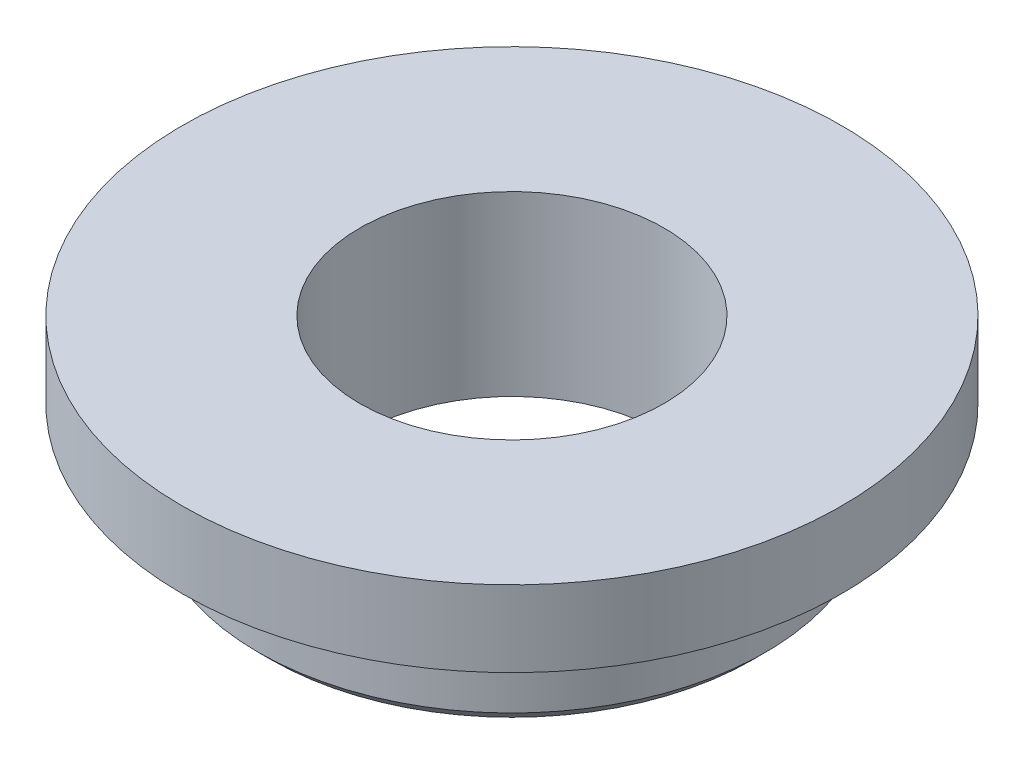
ISO-10303-21;
HEADER;
FILE_DESCRIPTION(('STEP AP214'),'2;1');
FILE_NAME('part.step','',(''),(''),'','','');
FILE_SCHEMA(('AUTOMOTIVE_DESIGN { 1 0 10303 214 1 1 1 1 }'));
ENDSEC;
DATA;
#1=APPLICATION_CONTEXT('core data for automotive mechanical design processes');
#2=APPLICATION_PROTOCOL_DEFINITION('international standard','automotive_design',2000,#1);
#3=PRODUCT_CONTEXT('',#1,'mechanical');
#4=PRODUCT('Part','Part','',(#3));
#5=PRODUCT_RELATED_PRODUCT_CATEGORY('part','',(#4));
#6=PRODUCT_DEFINITION_FORMATION('','',#4);
#7=PRODUCT_DEFINITION_CONTEXT('part definition',#1,'design');
#8=PRODUCT_DEFINITION('design','',#6,#7);
#9=PRODUCT_DEFINITION_SHAPE('','',#8);
#10=(LENGTH_UNIT() NAMED_UNIT(*) SI_UNIT(.MILLI.,.METRE.));
#11=(NAMED_UNIT(*) PLANE_ANGLE_UNIT() SI_UNIT($,.RADIAN.));
#12=(NAMED_UNIT(*) SI_UNIT($,.STERADIAN.) SOLID_ANGLE_UNIT());
#13=UNCERTAINTY_MEASURE_WITH_UNIT(LENGTH_MEASURE(1.E-05),#10,'distance_accuracy_value','');
#14=(GEOMETRIC_REPRESENTATION_CONTEXT(3) GLOBAL_UNCERTAINTY_ASSIGNED_CONTEXT((#13)) GLOBAL_UNIT_ASSIGNED_CONTEXT((#10,
#11,#12)) REPRESENTATION_CONTEXT('',''));
#15=CARTESIAN_POINT('',(0.,0.,0.));
#16=DIRECTION('',(0.,0.,1.));
#17=DIRECTION('',(1.,0.,0.));
#18=AXIS2_PLACEMENT_3D('',#15,#16,#17);
#19=CARTESIAN_POINT('',(0.,3.,0.));
#20=DIRECTION('',(0.,-1.,0.));
#21=DIRECTION('',(0.,0.,-1.));
#22=AXIS2_PLACEMENT_3D('',#19,#20,#21);
#23=CYLINDRICAL_SURFACE('',#22,13.);
#24=CARTESIAN_POINT('',(0.,3.,0.));
#25=DIRECTION('',(0.,1.,0.));
#26=DIRECTION('',(0.,0.,1.));
#27=AXIS2_PLACEMENT_3D('',#24,#25,#26);
#28=CIRCLE('',#27,13.);
#29=CARTESIAN_POINT('',(0.,3.,13.));
#30=VERTEX_POINT('',#29);
#31=EDGE_CURVE('E63',#30,#30,#28,.T.);
#32=ORIENTED_EDGE('',*,*,#31,.F.);
#33=EDGE_LOOP('',(#32));
#34=FACE_BOUND('',#33,.T.);
#35=CARTESIAN_POINT('',(0.,0.,0.));
#36=DIRECTION('',(0.,1.,0.));
#37=DIRECTION('',(0.,0.,1.));
#38=AXIS2_PLACEMENT_3D('',#35,#36,#37);
#39=CIRCLE('',#38,13.);
#40=CARTESIAN_POINT('',(0.,0.,13.));
#41=VERTEX_POINT('',#40);
#42=EDGE_CURVE('E64',#41,#41,#39,.T.);
#43=ORIENTED_EDGE('',*,*,#42,.T.);
#44=EDGE_LOOP('',(#43));
#45=FACE_BOUND('',#44,.T.);
#46=ADVANCED_FACE('F42',(#34,#45),#23,.T.);
#47=CARTESIAN_POINT('',(0.,3.,0.));
#48=DIRECTION('',(0.,1.,0.));
#49=DIRECTION('',(0.,0.,1.));
#50=AXIS2_PLACEMENT_3D('',#47,#48,#49);
#51=PLANE('',#50);
#52=CARTESIAN_POINT('',(0.,3.,0.));
#53=DIRECTION('',(0.,1.,0.));
#54=DIRECTION('',(0.,0.,1.));
#55=AXIS2_PLACEMENT_3D('',#52,#53,#54);
#56=CIRCLE('',#55,6.);
#57=CARTESIAN_POINT('',(0.,3.,6.));
#58=VERTEX_POINT('',#57);
#59=EDGE_CURVE('E70',#58,#58,#56,.T.);
#60=ORIENTED_EDGE('',*,*,#59,.F.);
#61=EDGE_LOOP('',(#60));
#62=FACE_BOUND('',#61,.T.);
#63=ORIENTED_EDGE('',*,*,#31,.T.);
#64=EDGE_LOOP('',(#63));
#65=FACE_BOUND('',#64,.T.);
#66=ADVANCED_FACE('F84',(#62,#65),#51,.T.);
#67=CARTESIAN_POINT('',(0.,0.,0.));
#68=DIRECTION('',(0.,1.,0.));
#69=DIRECTION('',(0.,0.,1.));
#70=AXIS2_PLACEMENT_3D('',#67,#68,#69);
#71=PLANE('',#70);
#72=CARTESIAN_POINT('',(0.,0.,0.));
#73=DIRECTION('',(0.,1.,0.));
#74=DIRECTION('',(0.,0.,1.));
#75=AXIS2_PLACEMENT_3D('',#72,#73,#74);
#76=CIRCLE('',#75,10.5);
#77=CARTESIAN_POINT('',(0.,0.,10.5));
#78=VERTEX_POINT('',#77);
#79=EDGE_CURVE('E50',#78,#78,#76,.T.);
#80=ORIENTED_EDGE('',*,*,#79,.T.);
#81=EDGE_LOOP('',(#80));
#82=FACE_BOUND('',#81,.T.);
#83=ORIENTED_EDGE('',*,*,#42,.F.);
#84=EDGE_LOOP('',(#83));
#85=FACE_BOUND('',#84,.T.);
#86=ADVANCED_FACE('F87',(#82,#85),#71,.F.);
#87=CARTESIAN_POINT('',(0.,-4.,0.));
#88=DIRECTION('',(0.,1.,0.));
#89=DIRECTION('',(0.,0.,1.));
#90=AXIS2_PLACEMENT_3D('',#87,#88,#89);
#91=CYLINDRICAL_SURFACE('',#90,10.);
#92=CARTESIAN_POINT('',(0.,-0.499999999999995,0.));
#93=DIRECTION('',(0.,1.,0.));
#94=DIRECTION('',(0.,0.,1.));
#95=AXIS2_PLACEMENT_3D('',#92,#93,#94);
#96=CIRCLE('',#95,10.);
#97=CARTESIAN_POINT('',(0.,-0.499999999999995,10.));
#98=VERTEX_POINT('',#97);
#99=EDGE_CURVE('E54',#98,#98,#96,.F.);
#100=ORIENTED_EDGE('',*,*,#99,.T.);
#101=EDGE_LOOP('',(#100));
#102=FACE_BOUND('',#101,.T.);
#103=CARTESIAN_POINT('',(0.,-3.49999999999999,0.));
#104=DIRECTION('',(0.,-1.,0.));
#105=DIRECTION('',(0.,0.,-1.));
#106=AXIS2_PLACEMENT_3D('',#103,#104,#105);
#107=CIRCLE('',#106,10.);
#108=CARTESIAN_POINT('',(0.,-3.49999999999999,-10.));
#109=VERTEX_POINT('',#108);
#110=EDGE_CURVE('E58',#109,#109,#107,.F.);
#111=ORIENTED_EDGE('',*,*,#110,.T.);
#112=EDGE_LOOP('',(#111));
#113=FACE_BOUND('',#112,.T.);
#114=ADVANCED_FACE('F97',(#102,#113),#91,.T.);
#115=CARTESIAN_POINT('',(0.,-4.,0.));
#116=DIRECTION('',(0.,-1.,0.));
#117=DIRECTION('',(0.,0.,-1.));
#118=AXIS2_PLACEMENT_3D('',#115,#116,#117);
#119=PLANE('',#118);
#120=CARTESIAN_POINT('',(0.,-4.,0.));
#121=DIRECTION('',(0.,1.,0.));
#122=DIRECTION('',(0.,0.,1.));
#123=AXIS2_PLACEMENT_3D('',#120,#121,#122);
#124=CIRCLE('',#123,6.);
#125=CARTESIAN_POINT('',(0.,-4.,6.));
#126=VERTEX_POINT('',#125);
#127=EDGE_CURVE('E67',#126,#126,#124,.T.);
#128=ORIENTED_EDGE('',*,*,#127,.T.);
#129=EDGE_LOOP('',(#128));
#130=FACE_BOUND('',#129,.T.);
#131=CARTESIAN_POINT('',(0.,-4.,0.));
#132=DIRECTION('',(0.,-1.,0.));
#133=DIRECTION('',(0.,0.,-1.));
#134=AXIS2_PLACEMENT_3D('',#131,#132,#133);
#135=CIRCLE('',#134,9.49999999999999);
#136=CARTESIAN_POINT('',(0.,-4.,-9.49999999999999));
#137=VERTEX_POINT('',#136);
#138=EDGE_CURVE('E10',#137,#137,#135,.T.);
#139=ORIENTED_EDGE('',*,*,#138,.T.);
#140=EDGE_LOOP('',(#139));
#141=FACE_BOUND('',#140,.T.);
#142=ADVANCED_FACE('F76',(#130,#141),#119,.T.);
#143=CARTESIAN_POINT('',(0.,-0.499999999999995,0.));
#144=DIRECTION('',(0.,1.,0.));
#145=DIRECTION('',(0.,0.,1.));
#146=AXIS2_PLACEMENT_3D('',#143,#144,#145);
#147=CONICAL_SURFACE('',#146,10.,0.785398163397445);
#148=ORIENTED_EDGE('',*,*,#79,.F.);
#149=EDGE_LOOP('',(#148));
#150=FACE_BOUND('',#149,.T.);
#151=ORIENTED_EDGE('',*,*,#99,.F.);
#152=EDGE_LOOP('',(#151));
#153=FACE_BOUND('',#152,.T.);
#154=ADVANCED_FACE('F105',(#150,#153),#147,.T.);
#155=CARTESIAN_POINT('',(0.,-4.,0.));
#156=DIRECTION('',(0.,1.,0.));
#157=DIRECTION('',(0.,0.,1.));
#158=AXIS2_PLACEMENT_3D('',#155,#156,#157);
#159=CONICAL_SURFACE('',#158,9.49999999999999,0.785398163397452);
#160=ORIENTED_EDGE('',*,*,#110,.F.);
#161=EDGE_LOOP('',(#160));
#162=FACE_BOUND('',#161,.T.);
#163=ORIENTED_EDGE('',*,*,#138,.F.);
#164=EDGE_LOOP('',(#163));
#165=FACE_BOUND('',#164,.T.);
#166=ADVANCED_FACE('F45',(#162,#165),#159,.T.);
#167=CARTESIAN_POINT('',(0.,-4.,0.));
#168=DIRECTION('',(0.,1.,0.));
#169=DIRECTION('',(0.,0.,1.));
#170=AXIS2_PLACEMENT_3D('',#167,#168,#169);
#171=CYLINDRICAL_SURFACE('',#170,6.);
#172=ORIENTED_EDGE('',*,*,#127,.F.);
#173=EDGE_LOOP('',(#172));
#174=FACE_BOUND('',#173,.T.);
#175=ORIENTED_EDGE('',*,*,#59,.T.);
#176=EDGE_LOOP('',(#175));
#177=FACE_BOUND('',#176,.T.);
#178=ADVANCED_FACE('F78',(#174,#177),#171,.F.);
#179=CLOSED_SHELL('',(#46,#66,#86,#114,#142,#154,#166,#178));
#180=MANIFOLD_SOLID_BREP('B2',#179);
#181=ADVANCED_BREP_SHAPE_REPRESENTATION('',(#18,#180),#14);
#182=SHAPE_DEFINITION_REPRESENTATION(#9,#181);
ENDSEC;
END-ISO-10303-21;
